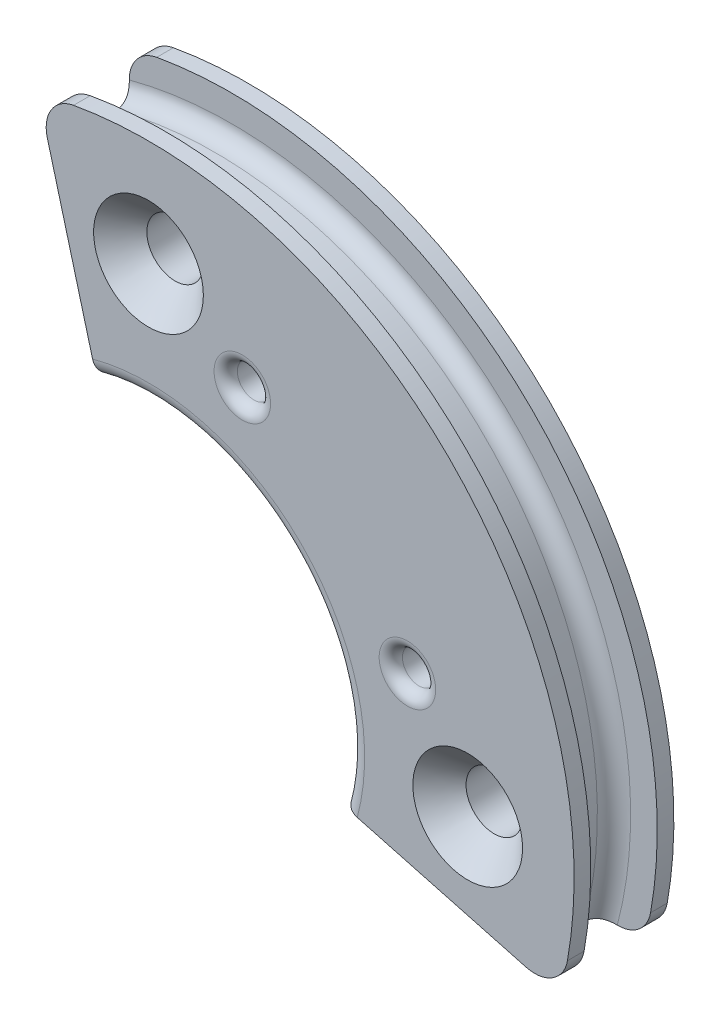
ISO-10303-21;
HEADER;
FILE_DESCRIPTION(('STEP AP214'),'2;1');
FILE_NAME('part.step','',(''),(''),'','','');
FILE_SCHEMA(('AUTOMOTIVE_DESIGN { 1 0 10303 214 1 1 1 1 }'));
ENDSEC;
DATA;
#1=APPLICATION_CONTEXT('core data for automotive mechanical design processes');
#2=APPLICATION_PROTOCOL_DEFINITION('international standard','automotive_design',2000,#1);
#3=PRODUCT_CONTEXT('',#1,'mechanical');
#4=PRODUCT('Part','Part','',(#3));
#5=PRODUCT_RELATED_PRODUCT_CATEGORY('part','',(#4));
#6=PRODUCT_DEFINITION_FORMATION('','',#4);
#7=PRODUCT_DEFINITION_CONTEXT('part definition',#1,'design');
#8=PRODUCT_DEFINITION('design','',#6,#7);
#9=PRODUCT_DEFINITION_SHAPE('','',#8);
#10=(LENGTH_UNIT() NAMED_UNIT(*) SI_UNIT(.MILLI.,.METRE.));
#11=(NAMED_UNIT(*) PLANE_ANGLE_UNIT() SI_UNIT($,.RADIAN.));
#12=(NAMED_UNIT(*) SI_UNIT($,.STERADIAN.) SOLID_ANGLE_UNIT());
#13=UNCERTAINTY_MEASURE_WITH_UNIT(LENGTH_MEASURE(1.E-05),#10,'distance_accuracy_value','');
#14=(GEOMETRIC_REPRESENTATION_CONTEXT(3) GLOBAL_UNCERTAINTY_ASSIGNED_CONTEXT((#13)) GLOBAL_UNIT_ASSIGNED_CONTEXT((#10,
#11,#12)) REPRESENTATION_CONTEXT('',''));
#15=CARTESIAN_POINT('',(0.,0.,0.));
#16=DIRECTION('',(0.,0.,1.));
#17=DIRECTION('',(1.,0.,0.));
#18=AXIS2_PLACEMENT_3D('',#15,#16,#17);
#19=CARTESIAN_POINT('',(0.,0.,1.5));
#20=DIRECTION('',(0.,0.,1.));
#21=DIRECTION('',(1.,0.,0.));
#22=AXIS2_PLACEMENT_3D('',#19,#20,#21);
#23=PLANE('',#22);
#24=CARTESIAN_POINT('',(2.82143232026971,7.78746026853087,1.5));
#25=DIRECTION('',(0.,0.,1.));
#26=DIRECTION('',(1.,0.,0.));
#27=AXIS2_PLACEMENT_3D('',#24,#25,#26);
#28=CIRCLE('',#27,0.85);
#29=CARTESIAN_POINT('',(3.67143232026971,7.78746026853087,1.5));
#30=VERTEX_POINT('',#29);
#31=EDGE_CURVE('E350',#30,#30,#28,.F.);
#32=ORIENTED_EDGE('',*,*,#31,.T.);
#33=EDGE_LOOP('',(#32));
#34=FACE_BOUND('',#33,.T.);
#35=CARTESIAN_POINT('',(7.78746026853084,2.82143232026975,1.5));
#36=DIRECTION('',(0.,0.,1.));
#37=DIRECTION('',(1.,0.,0.));
#38=AXIS2_PLACEMENT_3D('',#35,#36,#37);
#39=CIRCLE('',#38,0.850000000000001);
#40=CARTESIAN_POINT('',(8.63746026853084,2.82143232026975,1.5));
#41=VERTEX_POINT('',#40);
#42=EDGE_CURVE('E347',#41,#41,#39,.F.);
#43=ORIENTED_EDGE('',*,*,#42,.T.);
#44=EDGE_LOOP('',(#43));
#45=FACE_BOUND('',#44,.T.);
#46=CARTESIAN_POINT('',(9.6,0.,1.5));
#47=DIRECTION('',(0.,0.,1.));
#48=DIRECTION('',(1.,0.,0.));
#49=AXIS2_PLACEMENT_3D('',#46,#47,#48);
#50=CIRCLE('',#49,1.65);
#51=CARTESIAN_POINT('',(11.25,0.,1.5));
#52=VERTEX_POINT('',#51);
#53=EDGE_CURVE('E338',#52,#52,#50,.F.);
#54=ORIENTED_EDGE('',*,*,#53,.T.);
#55=EDGE_LOOP('',(#54));
#56=FACE_BOUND('',#55,.T.);
#57=CARTESIAN_POINT('',(1.00554662558682E-13,9.6,1.5));
#58=DIRECTION('',(0.,0.,1.));
#59=DIRECTION('',(1.,0.,0.));
#60=AXIS2_PLACEMENT_3D('',#57,#58,#59);
#61=CIRCLE('',#60,1.65);
#62=CARTESIAN_POINT('',(1.6500000000001,9.6,1.5));
#63=VERTEX_POINT('',#62);
#64=EDGE_CURVE('E335',#63,#63,#61,.F.);
#65=ORIENTED_EDGE('',*,*,#64,.T.);
#66=EDGE_LOOP('',(#65));
#67=FACE_BOUND('',#66,.T.);
#68=DIRECTION('',(-0.965925826289068,0.258819045102521,0.));
#69=VECTOR('',#68,1.);
#70=CARTESIAN_POINT('',(14.9002332262777,-3.9925054600165,1.5));
#71=LINE('',#70,#69);
#72=CARTESIAN_POINT('',(11.3569219381653,-3.0430780618347,1.5));
#73=VERTEX_POINT('',#72);
#74=CARTESIAN_POINT('',(6.27851787087894,-1.68232379316639,1.5));
#75=VERTEX_POINT('',#74);
#76=EDGE_CURVE('E467',#73,#75,#71,.T.);
#77=ORIENTED_EDGE('',*,*,#76,.F.);
#78=CARTESIAN_POINT('',(11.6157409832678,-2.07715223554563,1.5));
#79=DIRECTION('',(0.,0.,1.));
#80=DIRECTION('',(1.,0.,0.));
#81=AXIS2_PLACEMENT_3D('',#78,#79,#80);
#82=CIRCLE('',#81,1.);
#83=CARTESIAN_POINT('',(12.6001258123583,-2.2531820860156,1.5));
#84=VERTEX_POINT('',#83);
#85=EDGE_CURVE('E309',#73,#84,#82,.T.);
#86=ORIENTED_EDGE('',*,*,#85,.T.);
#87=CARTESIAN_POINT('',(0.,0.,1.5));
#88=DIRECTION('',(0.,0.,1.));
#89=DIRECTION('',(1.,0.,0.));
#90=AXIS2_PLACEMENT_3D('',#87,#88,#89);
#91=CIRCLE('',#90,12.8);
#92=CARTESIAN_POINT('',(-2.25318208601565,12.6001258123583,1.5));
#93=VERTEX_POINT('',#92);
#94=EDGE_CURVE('E443',#84,#93,#91,.T.);
#95=ORIENTED_EDGE('',*,*,#94,.T.);
#96=CARTESIAN_POINT('',(-2.07715223554568,11.6157409832678,1.5));
#97=DIRECTION('',(0.,0.,1.));
#98=DIRECTION('',(1.,0.,0.));
#99=AXIS2_PLACEMENT_3D('',#96,#97,#98);
#100=CIRCLE('',#99,1.);
#101=CARTESIAN_POINT('',(-3.04307806183475,11.3569219381653,1.5));
#102=VERTEX_POINT('',#101);
#103=EDGE_CURVE('E306',#93,#102,#100,.T.);
#104=ORIENTED_EDGE('',*,*,#103,.T.);
#105=DIRECTION('',(-0.258819045102525,0.965925826289067,0.));
#106=VECTOR('',#105,1.);
#107=CARTESIAN_POINT('',(-3.74363575167314,13.9714388302752,1.5));
#108=LINE('',#107,#106);
#109=CARTESIAN_POINT('',(-1.68232379316641,6.27851787087894,1.5));
#110=VERTEX_POINT('',#109);
#111=EDGE_CURVE('E465',#110,#102,#108,.T.);
#112=ORIENTED_EDGE('',*,*,#111,.F.);
#113=CARTESIAN_POINT('',(0.,0.,1.5));
#114=DIRECTION('',(0.,0.,1.));
#115=DIRECTION('',(1.,0.,0.));
#116=AXIS2_PLACEMENT_3D('',#113,#114,#115);
#117=CIRCLE('',#116,6.5);
#118=EDGE_CURVE('E192',#110,#75,#117,.F.);
#119=ORIENTED_EDGE('',*,*,#118,.T.);
#120=EDGE_LOOP('',(#77,#86,#95,#104,#112,#119));
#121=FACE_BOUND('',#120,.T.);
#122=ADVANCED_FACE('F33',(#34,#45,#56,#67,#121),#23,.T.);
#123=CARTESIAN_POINT('',(0.,0.,-1.5));
#124=DIRECTION('',(0.,0.,1.));
#125=DIRECTION('',(1.,0.,0.));
#126=AXIS2_PLACEMENT_3D('',#123,#124,#125);
#127=PLANE('',#126);
#128=CARTESIAN_POINT('',(7.78746026853084,2.82143232026975,-1.5));
#129=DIRECTION('',(0.,0.,1.));
#130=DIRECTION('',(1.,0.,0.));
#131=AXIS2_PLACEMENT_3D('',#128,#129,#130);
#132=CIRCLE('',#131,0.850000000000001);
#133=CARTESIAN_POINT('',(8.63746026853084,2.82143232026975,-1.5));
#134=VERTEX_POINT('',#133);
#135=EDGE_CURVE('E358',#134,#134,#132,.T.);
#136=ORIENTED_EDGE('',*,*,#135,.T.);
#137=EDGE_LOOP('',(#136));
#138=FACE_BOUND('',#137,.T.);
#139=CARTESIAN_POINT('',(2.82143232026971,7.78746026853087,-1.5));
#140=DIRECTION('',(0.,0.,1.));
#141=DIRECTION('',(1.,0.,0.));
#142=AXIS2_PLACEMENT_3D('',#139,#140,#141);
#143=CIRCLE('',#142,0.85);
#144=CARTESIAN_POINT('',(3.67143232026971,7.78746026853087,-1.5));
#145=VERTEX_POINT('',#144);
#146=EDGE_CURVE('E355',#145,#145,#143,.T.);
#147=ORIENTED_EDGE('',*,*,#146,.T.);
#148=EDGE_LOOP('',(#147));
#149=FACE_BOUND('',#148,.T.);
#150=CARTESIAN_POINT('',(0.,0.,-1.5));
#151=DIRECTION('',(0.,0.,1.));
#152=DIRECTION('',(1.,0.,0.));
#153=AXIS2_PLACEMENT_3D('',#150,#151,#152);
#154=CIRCLE('',#153,12.8);
#155=CARTESIAN_POINT('',(12.6001258123583,-2.2531820860156,-1.5));
#156=VERTEX_POINT('',#155);
#157=CARTESIAN_POINT('',(-2.25318208601565,12.6001258123583,-1.5));
#158=VERTEX_POINT('',#157);
#159=EDGE_CURVE('E375',#156,#158,#154,.T.);
#160=ORIENTED_EDGE('',*,*,#159,.F.);
#161=CARTESIAN_POINT('',(11.6157409832678,-2.07715223554563,-1.5));
#162=DIRECTION('',(0.,0.,1.));
#163=DIRECTION('',(1.,0.,0.));
#164=AXIS2_PLACEMENT_3D('',#161,#162,#163);
#165=CIRCLE('',#164,1.);
#166=CARTESIAN_POINT('',(11.3569219381653,-3.0430780618347,-1.5));
#167=VERTEX_POINT('',#166);
#168=EDGE_CURVE('E300',#156,#167,#165,.F.);
#169=ORIENTED_EDGE('',*,*,#168,.T.);
#170=DIRECTION('',(-0.965925826289068,0.258819045102521,0.));
#171=VECTOR('',#170,1.);
#172=CARTESIAN_POINT('',(14.9002332262777,-3.9925054600165,-1.5));
#173=LINE('',#172,#171);
#174=CARTESIAN_POINT('',(6.27851787087894,-1.68232379316639,-1.5));
#175=VERTEX_POINT('',#174);
#176=EDGE_CURVE('E463',#167,#175,#173,.T.);
#177=ORIENTED_EDGE('',*,*,#176,.T.);
#178=CARTESIAN_POINT('',(0.,0.,-1.5));
#179=DIRECTION('',(0.,0.,1.));
#180=DIRECTION('',(1.,0.,0.));
#181=AXIS2_PLACEMENT_3D('',#178,#179,#180);
#182=CIRCLE('',#181,6.5);
#183=CARTESIAN_POINT('',(-1.68232379316641,6.27851787087894,-1.5));
#184=VERTEX_POINT('',#183);
#185=EDGE_CURVE('E200',#175,#184,#182,.T.);
#186=ORIENTED_EDGE('',*,*,#185,.T.);
#187=DIRECTION('',(-0.258819045102525,0.965925826289067,0.));
#188=VECTOR('',#187,1.);
#189=CARTESIAN_POINT('',(-3.74363575167314,13.9714388302752,-1.5));
#190=LINE('',#189,#188);
#191=CARTESIAN_POINT('',(-3.04307806183475,11.3569219381653,-1.5));
#192=VERTEX_POINT('',#191);
#193=EDGE_CURVE('E154',#184,#192,#190,.T.);
#194=ORIENTED_EDGE('',*,*,#193,.T.);
#195=CARTESIAN_POINT('',(-2.07715223554568,11.6157409832678,-1.5));
#196=DIRECTION('',(0.,0.,1.));
#197=DIRECTION('',(1.,0.,0.));
#198=AXIS2_PLACEMENT_3D('',#195,#196,#197);
#199=CIRCLE('',#198,1.);
#200=EDGE_CURVE('E307',#192,#158,#199,.F.);
#201=ORIENTED_EDGE('',*,*,#200,.T.);
#202=EDGE_LOOP('',(#160,#169,#177,#186,#194,#201));
#203=FACE_BOUND('',#202,.T.);
#204=CARTESIAN_POINT('',(9.6,0.,-1.5));
#205=DIRECTION('',(0.,0.,1.));
#206=DIRECTION('',(1.,0.,0.));
#207=AXIS2_PLACEMENT_3D('',#204,#205,#206);
#208=CIRCLE('',#207,0.85);
#209=CARTESIAN_POINT('',(10.45,0.,-1.5));
#210=VERTEX_POINT('',#209);
#211=EDGE_CURVE('E180',#210,#210,#208,.T.);
#212=ORIENTED_EDGE('',*,*,#211,.T.);
#213=EDGE_LOOP('',(#212));
#214=FACE_BOUND('',#213,.T.);
#215=CARTESIAN_POINT('',(1.00554662558682E-13,9.6,-1.5));
#216=DIRECTION('',(0.,0.,1.));
#217=DIRECTION('',(1.,0.,0.));
#218=AXIS2_PLACEMENT_3D('',#215,#216,#217);
#219=CIRCLE('',#218,0.85);
#220=CARTESIAN_POINT('',(0.8500000000001,9.6,-1.5));
#221=VERTEX_POINT('',#220);
#222=EDGE_CURVE('E172',#221,#221,#219,.T.);
#223=ORIENTED_EDGE('',*,*,#222,.T.);
#224=EDGE_LOOP('',(#223));
#225=FACE_BOUND('',#224,.T.);
#226=ADVANCED_FACE('F267',(#138,#149,#203,#214,#225),#127,.F.);
#227=CARTESIAN_POINT('',(0.,0.,1.5));
#228=DIRECTION('',(0.,0.,-1.));
#229=DIRECTION('',(-1.,0.,0.));
#230=AXIS2_PLACEMENT_3D('',#227,#228,#229);
#231=CYLINDRICAL_SURFACE('',#230,6.);
#232=DIRECTION('',(0.,0.,-1.));
#233=VECTOR('',#232,1.);
#234=CARTESIAN_POINT('',(5.79555495773441,-1.55291427061513,1.5));
#235=LINE('',#234,#233);
#236=CARTESIAN_POINT('',(5.79555495773441,-1.55291427061513,1.));
#237=VERTEX_POINT('',#236);
#238=CARTESIAN_POINT('',(5.79555495773441,-1.55291427061513,-1.));
#239=VERTEX_POINT('',#238);
#240=EDGE_CURVE('E449',#237,#239,#235,.T.);
#241=ORIENTED_EDGE('',*,*,#240,.F.);
#242=CARTESIAN_POINT('',(0.,0.,1.));
#243=DIRECTION('',(0.,0.,1.));
#244=DIRECTION('',(1.,0.,0.));
#245=AXIS2_PLACEMENT_3D('',#242,#243,#244);
#246=CIRCLE('',#245,6.);
#247=CARTESIAN_POINT('',(-1.55291427061515,5.7955549577344,1.));
#248=VERTEX_POINT('',#247);
#249=EDGE_CURVE('E185',#237,#248,#246,.T.);
#250=ORIENTED_EDGE('',*,*,#249,.T.);
#251=DIRECTION('',(0.,0.,-1.));
#252=VECTOR('',#251,1.);
#253=CARTESIAN_POINT('',(-1.55291427061515,5.7955549577344,1.5));
#254=LINE('',#253,#252);
#255=CARTESIAN_POINT('',(-1.55291427061515,5.7955549577344,-1.));
#256=VERTEX_POINT('',#255);
#257=EDGE_CURVE('E457',#256,#248,#254,.F.);
#258=ORIENTED_EDGE('',*,*,#257,.F.);
#259=CARTESIAN_POINT('',(0.,0.,-1.));
#260=DIRECTION('',(0.,0.,1.));
#261=DIRECTION('',(1.,0.,0.));
#262=AXIS2_PLACEMENT_3D('',#259,#260,#261);
#263=CIRCLE('',#262,6.);
#264=EDGE_CURVE('E183',#256,#239,#263,.F.);
#265=ORIENTED_EDGE('',*,*,#264,.T.);
#266=EDGE_LOOP('',(#241,#250,#258,#265));
#267=FACE_BOUND('',#266,.T.);
#268=ADVANCED_FACE('F273',(#267),#231,.F.);
#269=CARTESIAN_POINT('',(9.6,0.,1.5));
#270=DIRECTION('',(0.,0.,-1.));
#271=DIRECTION('',(-1.,0.,0.));
#272=AXIS2_PLACEMENT_3D('',#269,#270,#271);
#273=CYLINDRICAL_SURFACE('',#272,0.85);
#274=CARTESIAN_POINT('',(9.6,0.,0.700000000000005));
#275=DIRECTION('',(0.,0.,1.));
#276=DIRECTION('',(1.,0.,0.));
#277=AXIS2_PLACEMENT_3D('',#274,#275,#276);
#278=CIRCLE('',#277,0.85);
#279=CARTESIAN_POINT('',(10.45,0.,0.700000000000005));
#280=VERTEX_POINT('',#279);
#281=EDGE_CURVE('E330',#280,#280,#278,.T.);
#282=ORIENTED_EDGE('',*,*,#281,.T.);
#283=EDGE_LOOP('',(#282));
#284=FACE_BOUND('',#283,.T.);
#285=ORIENTED_EDGE('',*,*,#211,.F.);
#286=EDGE_LOOP('',(#285));
#287=FACE_BOUND('',#286,.T.);
#288=ADVANCED_FACE('F381',(#284,#287),#273,.F.);
#289=CARTESIAN_POINT('',(1.00554662558682E-13,9.6,1.5));
#290=DIRECTION('',(0.,0.,-1.));
#291=DIRECTION('',(-1.,0.,0.));
#292=AXIS2_PLACEMENT_3D('',#289,#290,#291);
#293=CYLINDRICAL_SURFACE('',#292,0.85);
#294=CARTESIAN_POINT('',(1.00554662558682E-13,9.6,0.700000000000002));
#295=DIRECTION('',(0.,0.,1.));
#296=DIRECTION('',(1.,0.,0.));
#297=AXIS2_PLACEMENT_3D('',#294,#295,#296);
#298=CIRCLE('',#297,0.85);
#299=CARTESIAN_POINT('',(0.8500000000001,9.6,0.700000000000002));
#300=VERTEX_POINT('',#299);
#301=EDGE_CURVE('E341',#300,#300,#298,.T.);
#302=ORIENTED_EDGE('',*,*,#301,.T.);
#303=EDGE_LOOP('',(#302));
#304=FACE_BOUND('',#303,.T.);
#305=ORIENTED_EDGE('',*,*,#222,.F.);
#306=EDGE_LOOP('',(#305));
#307=FACE_BOUND('',#306,.T.);
#308=ADVANCED_FACE('F264',(#304,#307),#293,.F.);
#309=CARTESIAN_POINT('',(0.,0.,-0.499999999999998));
#310=DIRECTION('',(0.,0.,1.));
#311=DIRECTION('',(1.,0.,0.));
#312=AXIS2_PLACEMENT_3D('',#309,#310,#311);
#313=TOROIDAL_SURFACE('',#312,12.,0.500000000000002);
#314=CARTESIAN_POINT('',(11.5911099154688,-3.10582854123025,-0.499999999999998));
#315=DIRECTION('',(0.258819045102521,0.965925826289068,0.));
#316=DIRECTION('',(-0.965925826289068,0.258819045102521,0.));
#317=AXIS2_PLACEMENT_3D('',#314,#315,#316);
#318=CIRCLE('',#317,0.500000000000002);
#319=CARTESIAN_POINT('',(11.3569219381653,-3.0430780618347,-0.937285225707565));
#320=VERTEX_POINT('',#319);
#321=CARTESIAN_POINT('',(11.1081470023243,-2.97641901867899,-0.499999999999998));
#322=VERTEX_POINT('',#321);
#323=EDGE_CURVE('E452',#320,#322,#318,.T.);
#324=ORIENTED_EDGE('',*,*,#323,.F.);
#325=CARTESIAN_POINT('',(11.3569219381653,-3.0430780618347,-0.937285225707565));
#326=CARTESIAN_POINT('',(11.3788907022271,-3.04899831611114,-0.949943539683777));
#327=CARTESIAN_POINT('',(11.4020780861868,-3.05437532809976,-0.960766771828405));
#328=CARTESIAN_POINT('',(11.4496007428172,-3.06353569894288,-0.978371417856458));
#329=CARTESIAN_POINT('',(11.4738969178736,-3.06735312809629,-0.985240754489292));
#330=CARTESIAN_POINT('',(11.5149442494263,-3.07219577508378,-0.993465018538642));
#331=CARTESIAN_POINT('',(11.531426924697,-3.07372956647898,-0.995903041619362));
#332=CARTESIAN_POINT('',(11.5648655383223,-3.07600064981872,-0.999184648848311));
#333=CARTESIAN_POINT('',(11.581824849703,-3.07672517119939,-1.00000282200904));
#334=CARTESIAN_POINT('',(11.59879381403,-3.07700862196078,-1.00000000000002));
#335=B_SPLINE_CURVE_WITH_KNOTS('',3,(#325,#326,#327,#328,#329,#330,#331,#332,#333,#334),
.UNSPECIFIED.,.F.,.F.,(4,2,2,2,4),(0.,0.0780439203151207,0.154277705368697,0.204380010066996,
0.25526224375088),.UNSPECIFIED.);
#336=CARTESIAN_POINT('',(11.59879381403,-3.0770086219606,-1.));
#337=VERTEX_POINT('',#336);
#338=EDGE_CURVE('E216',#320,#337,#335,.T.);
#339=ORIENTED_EDGE('',*,*,#338,.T.);
#340=CARTESIAN_POINT('',(0.,0.,-1.));
#341=DIRECTION('',(0.,0.,1.));
#342=DIRECTION('',(1.,0.,0.));
#343=AXIS2_PLACEMENT_3D('',#340,#341,#342);
#344=CIRCLE('',#343,12.);
#345=CARTESIAN_POINT('',(-3.07700862196066,11.59879381403,-1.));
#346=VERTEX_POINT('',#345);
#347=EDGE_CURVE('E174',#337,#346,#344,.T.);
#348=ORIENTED_EDGE('',*,*,#347,.T.);
#349=CARTESIAN_POINT('',(-3.07700862196066,11.59879381403,-1.));
#350=CARTESIAN_POINT('',(-3.07660458449419,11.5727601819554,-1.00003894836341));
#351=CARTESIAN_POINT('',(-3.07511026037198,11.5467286746794,-0.998086003587239));
#352=CARTESIAN_POINT('',(-3.07027226218953,11.4960485993055,-0.990321356288697));
#353=CARTESIAN_POINT('',(-3.06697226123266,11.4713819615224,-0.984600153749769));
#354=CARTESIAN_POINT('',(-3.06020836080265,11.4317329932909,-0.972022151730217));
#355=CARTESIAN_POINT('',(-3.05718836163848,11.4163292860042,-0.966226791143053));
#356=CARTESIAN_POINT('',(-3.05054927334866,11.386085156282,-0.952986500989708));
#357=CARTESIAN_POINT('',(-3.0469215908292,11.3712572336561,-0.945517299304913));
#358=CARTESIAN_POINT('',(-3.04307806183475,11.3569219381653,-0.937285225707566));
#359=B_SPLINE_CURVE_WITH_KNOTS('',3,(#349,#350,#351,#352,#353,#354,#355,#356,#357,#358),
.UNSPECIFIED.,.F.,.F.,(4,2,2,2,4),(0.,0.0780427071951764,0.154276292796439,0.204379307922696,
0.255262197451977),.UNSPECIFIED.);
#360=CARTESIAN_POINT('',(-3.04307806183475,11.3569219381653,-0.937285225707565));
#361=VERTEX_POINT('',#360);
#362=EDGE_CURVE('E209',#346,#361,#359,.T.);
#363=ORIENTED_EDGE('',*,*,#362,.T.);
#364=CARTESIAN_POINT('',(-3.1058285412303,11.5911099154688,-0.499999999999998));
#365=DIRECTION('',(0.965925826289067,0.258819045102525,0.));
#366=DIRECTION('',(-0.258819045102525,0.965925826289067,0.));
#367=AXIS2_PLACEMENT_3D('',#364,#365,#366);
#368=CIRCLE('',#367,0.500000000000002);
#369=CARTESIAN_POINT('',(-2.97641901867904,11.1081470023243,-0.499999999999998));
#370=VERTEX_POINT('',#369);
#371=EDGE_CURVE('E164',#370,#361,#368,.T.);
#372=ORIENTED_EDGE('',*,*,#371,.F.);
#373=CARTESIAN_POINT('',(0.,0.,-0.499999999999998));
#374=DIRECTION('',(0.,0.,1.));
#375=DIRECTION('',(1.,0.,0.));
#376=AXIS2_PLACEMENT_3D('',#373,#374,#375);
#377=CIRCLE('',#376,11.5);
#378=EDGE_CURVE('E163',#322,#370,#377,.T.);
#379=ORIENTED_EDGE('',*,*,#378,.F.);
#380=EDGE_LOOP('',(#324,#339,#348,#363,#372,#379));
#381=FACE_BOUND('',#380,.T.);
#382=ADVANCED_FACE('F222',(#381),#313,.F.);
#383=CARTESIAN_POINT('',(0.,0.,0.));
#384=DIRECTION('',(0.,0.,1.));
#385=DIRECTION('',(1.,0.,0.));
#386=AXIS2_PLACEMENT_3D('',#383,#384,#385);
#387=CYLINDRICAL_SURFACE('',#386,11.5);
#388=DIRECTION('',(0.,0.,1.));
#389=VECTOR('',#388,1.);
#390=CARTESIAN_POINT('',(11.1081470023243,-2.97641901867899,0.));
#391=LINE('',#390,#389);
#392=CARTESIAN_POINT('',(11.1081470023243,-2.97641901867899,0.499999999999998));
#393=VERTEX_POINT('',#392);
#394=EDGE_CURVE('E454',#322,#393,#391,.T.);
#395=ORIENTED_EDGE('',*,*,#394,.F.);
#396=ORIENTED_EDGE('',*,*,#378,.T.);
#397=DIRECTION('',(0.,0.,1.));
#398=VECTOR('',#397,1.);
#399=CARTESIAN_POINT('',(-2.97641901867904,11.1081470023243,0.));
#400=LINE('',#399,#398);
#401=CARTESIAN_POINT('',(-2.97641901867904,11.1081470023243,0.499999999999998));
#402=VERTEX_POINT('',#401);
#403=EDGE_CURVE('E149',#402,#370,#400,.F.);
#404=ORIENTED_EDGE('',*,*,#403,.F.);
#405=CARTESIAN_POINT('',(0.,0.,0.499999999999998));
#406=DIRECTION('',(0.,0.,1.));
#407=DIRECTION('',(1.,0.,0.));
#408=AXIS2_PLACEMENT_3D('',#405,#406,#407);
#409=CIRCLE('',#408,11.5);
#410=EDGE_CURVE('E161',#393,#402,#409,.T.);
#411=ORIENTED_EDGE('',*,*,#410,.F.);
#412=EDGE_LOOP('',(#395,#396,#404,#411));
#413=FACE_BOUND('',#412,.T.);
#414=ADVANCED_FACE('F160',(#413),#387,.T.);
#415=CARTESIAN_POINT('',(0.,0.,0.499999999999998));
#416=DIRECTION('',(0.,0.,1.));
#417=DIRECTION('',(1.,0.,0.));
#418=AXIS2_PLACEMENT_3D('',#415,#416,#417);
#419=TOROIDAL_SURFACE('',#418,12.,0.500000000000002);
#420=CARTESIAN_POINT('',(0.,0.,1.));
#421=DIRECTION('',(0.,0.,1.));
#422=DIRECTION('',(1.,0.,0.));
#423=AXIS2_PLACEMENT_3D('',#420,#421,#422);
#424=CIRCLE('',#423,12.);
#425=CARTESIAN_POINT('',(11.59879381403,-3.07700862196061,1.));
#426=VERTEX_POINT('',#425);
#427=CARTESIAN_POINT('',(-3.07700862196067,11.59879381403,1.));
#428=VERTEX_POINT('',#427);
#429=EDGE_CURVE('E170',#426,#428,#424,.T.);
#430=ORIENTED_EDGE('',*,*,#429,.F.);
#431=CARTESIAN_POINT('',(11.59879381403,-3.07700862196061,1.));
#432=CARTESIAN_POINT('',(11.5727601819554,-3.07660458449414,1.00003894836341));
#433=CARTESIAN_POINT('',(11.5467286746794,-3.07511026037193,0.998086003587239));
#434=CARTESIAN_POINT('',(11.4960485993056,-3.07027226218948,0.990321356288697));
#435=CARTESIAN_POINT('',(11.4713819615224,-3.06697226123261,0.984600153749768));
#436=CARTESIAN_POINT('',(11.4317329932909,-3.0602083608026,0.972022151730217));
#437=CARTESIAN_POINT('',(11.4163292860042,-3.05718836163843,0.966226791143054));
#438=CARTESIAN_POINT('',(11.386085156282,-3.05054927334861,0.952986500989709));
#439=CARTESIAN_POINT('',(11.3712572336561,-3.04692159082915,0.945517299304914));
#440=CARTESIAN_POINT('',(11.3569219381653,-3.0430780618347,0.937285225707565));
#441=B_SPLINE_CURVE_WITH_KNOTS('',3,(#431,#432,#433,#434,#435,#436,#437,#438,#439,#440),
.UNSPECIFIED.,.F.,.F.,(4,2,2,2,4),(0.,0.0780427071951764,0.154276292796439,0.204379307922698,
0.255262197451979),.UNSPECIFIED.);
#442=CARTESIAN_POINT('',(11.3569219381653,-3.0430780618347,0.937285225707565));
#443=VERTEX_POINT('',#442);
#444=EDGE_CURVE('E247',#426,#443,#441,.T.);
#445=ORIENTED_EDGE('',*,*,#444,.T.);
#446=CARTESIAN_POINT('',(11.5911099154688,-3.10582854123025,0.499999999999998));
#447=DIRECTION('',(0.258819045102521,0.965925826289068,0.));
#448=DIRECTION('',(-0.965925826289068,0.258819045102521,0.));
#449=AXIS2_PLACEMENT_3D('',#446,#447,#448);
#450=CIRCLE('',#449,0.500000000000002);
#451=EDGE_CURVE('E169',#393,#443,#450,.T.);
#452=ORIENTED_EDGE('',*,*,#451,.F.);
#453=ORIENTED_EDGE('',*,*,#410,.T.);
#454=CARTESIAN_POINT('',(-3.1058285412303,11.5911099154688,0.499999999999998));
#455=DIRECTION('',(0.965925826289067,0.258819045102525,0.));
#456=DIRECTION('',(-0.258819045102525,0.965925826289067,0.));
#457=AXIS2_PLACEMENT_3D('',#454,#455,#456);
#458=CIRCLE('',#457,0.500000000000002);
#459=CARTESIAN_POINT('',(-3.04307806183475,11.3569219381653,0.937285225707565));
#460=VERTEX_POINT('',#459);
#461=EDGE_CURVE('E145',#460,#402,#458,.T.);
#462=ORIENTED_EDGE('',*,*,#461,.F.);
#463=CARTESIAN_POINT('',(-3.04307806183475,11.3569219381653,0.937285225707565));
#464=CARTESIAN_POINT('',(-3.04899831611119,11.3788907022271,0.949943539683777));
#465=CARTESIAN_POINT('',(-3.05437532809981,11.4020780861868,0.960766771828404));
#466=CARTESIAN_POINT('',(-3.06353569894293,11.4496007428172,0.978371417856458));
#467=CARTESIAN_POINT('',(-3.06735312809634,11.4738969178736,0.985240754489291));
#468=CARTESIAN_POINT('',(-3.07219577508383,11.5149442494263,0.993465018538642));
#469=CARTESIAN_POINT('',(-3.07372956647903,11.5314269246969,0.995903041619362));
#470=CARTESIAN_POINT('',(-3.07600064981877,11.5648655383223,0.999184648848312));
#471=CARTESIAN_POINT('',(-3.07672517119944,11.5818248497029,1.00000282200904));
#472=CARTESIAN_POINT('',(-3.07700862196083,11.5987938140299,1.00000000000002));
#473=B_SPLINE_CURVE_WITH_KNOTS('',3,(#463,#464,#465,#466,#467,#468,#469,#470,#471,#472),
.UNSPECIFIED.,.F.,.F.,(4,2,2,2,4),(0.,0.0780439203151175,0.154277705368694,0.204380010066994,
0.255262243750883),.UNSPECIFIED.);
#474=EDGE_CURVE('E48',#460,#428,#473,.T.);
#475=ORIENTED_EDGE('',*,*,#474,.T.);
#476=EDGE_LOOP('',(#430,#445,#452,#453,#462,#475));
#477=FACE_BOUND('',#476,.T.);
#478=ADVANCED_FACE('F167',(#477),#419,.F.);
#479=CARTESIAN_POINT('',(12.,0.,-1.));
#480=DIRECTION('',(0.,0.,1.));
#481=DIRECTION('',(1.,0.,0.));
#482=AXIS2_PLACEMENT_3D('',#479,#480,#481);
#483=PLANE('',#482);
#484=ORIENTED_EDGE('',*,*,#347,.F.);
#485=CARTESIAN_POINT('',(11.6157409832678,-2.07715223554563,-1.));
#486=DIRECTION('',(0.,0.,1.));
#487=DIRECTION('',(1.,0.,0.));
#488=AXIS2_PLACEMENT_3D('',#485,#486,#487);
#489=CIRCLE('',#488,1.);
#490=CARTESIAN_POINT('',(12.6001258123583,-2.2531820860156,-1.));
#491=VERTEX_POINT('',#490);
#492=EDGE_CURVE('E486',#337,#491,#489,.T.);
#493=ORIENTED_EDGE('',*,*,#492,.T.);
#494=CARTESIAN_POINT('',(0.,0.,-1.));
#495=DIRECTION('',(0.,0.,1.));
#496=DIRECTION('',(1.,0.,0.));
#497=AXIS2_PLACEMENT_3D('',#494,#495,#496);
#498=CIRCLE('',#497,12.8);
#499=CARTESIAN_POINT('',(-2.25318208601565,12.6001258123583,-1.));
#500=VERTEX_POINT('',#499);
#501=EDGE_CURVE('E437',#491,#500,#498,.T.);
#502=ORIENTED_EDGE('',*,*,#501,.T.);
#503=CARTESIAN_POINT('',(-2.07715223554568,11.6157409832678,-1.));
#504=DIRECTION('',(0.,0.,1.));
#505=DIRECTION('',(1.,0.,0.));
#506=AXIS2_PLACEMENT_3D('',#503,#504,#505);
#507=CIRCLE('',#506,1.);
#508=EDGE_CURVE('E485',#500,#346,#507,.T.);
#509=ORIENTED_EDGE('',*,*,#508,.T.);
#510=EDGE_LOOP('',(#484,#493,#502,#509));
#511=FACE_BOUND('',#510,.T.);
#512=ADVANCED_FACE('F257',(#511),#483,.T.);
#513=CARTESIAN_POINT('',(0.,0.,0.));
#514=DIRECTION('',(0.,0.,1.));
#515=DIRECTION('',(1.,0.,0.));
#516=AXIS2_PLACEMENT_3D('',#513,#514,#515);
#517=CYLINDRICAL_SURFACE('',#516,12.8);
#518=ORIENTED_EDGE('',*,*,#501,.F.);
#519=DIRECTION('',(0.,0.,1.));
#520=VECTOR('',#519,1.);
#521=CARTESIAN_POINT('',(12.6001258123583,-2.2531820860156,0.));
#522=LINE('',#521,#520);
#523=EDGE_CURVE('E302',#491,#156,#522,.F.);
#524=ORIENTED_EDGE('',*,*,#523,.T.);
#525=ORIENTED_EDGE('',*,*,#159,.T.);
#526=DIRECTION('',(0.,0.,1.));
#527=VECTOR('',#526,1.);
#528=CARTESIAN_POINT('',(-2.25318208601565,12.6001258123583,0.));
#529=LINE('',#528,#527);
#530=EDGE_CURVE('E439',#158,#500,#529,.T.);
#531=ORIENTED_EDGE('',*,*,#530,.T.);
#532=EDGE_LOOP('',(#518,#524,#525,#531));
#533=FACE_BOUND('',#532,.T.);
#534=ADVANCED_FACE('F427',(#533),#517,.T.);
#535=CARTESIAN_POINT('',(0.,0.,0.));
#536=DIRECTION('',(0.,0.,1.));
#537=DIRECTION('',(1.,0.,0.));
#538=AXIS2_PLACEMENT_3D('',#535,#536,#537);
#539=CYLINDRICAL_SURFACE('',#538,12.8);
#540=ORIENTED_EDGE('',*,*,#94,.F.);
#541=DIRECTION('',(0.,0.,1.));
#542=VECTOR('',#541,1.);
#543=CARTESIAN_POINT('',(12.6001258123583,-2.2531820860156,0.));
#544=LINE('',#543,#542);
#545=CARTESIAN_POINT('',(12.6001258123583,-2.2531820860156,1.));
#546=VERTEX_POINT('',#545);
#547=EDGE_CURVE('E317',#84,#546,#544,.F.);
#548=ORIENTED_EDGE('',*,*,#547,.T.);
#549=CARTESIAN_POINT('',(0.,0.,1.));
#550=DIRECTION('',(0.,0.,1.));
#551=DIRECTION('',(1.,0.,0.));
#552=AXIS2_PLACEMENT_3D('',#549,#550,#551);
#553=CIRCLE('',#552,12.8);
#554=CARTESIAN_POINT('',(-2.25318208601565,12.6001258123583,1.));
#555=VERTEX_POINT('',#554);
#556=EDGE_CURVE('E324',#546,#555,#553,.T.);
#557=ORIENTED_EDGE('',*,*,#556,.T.);
#558=DIRECTION('',(0.,0.,1.));
#559=VECTOR('',#558,1.);
#560=CARTESIAN_POINT('',(-2.25318208601565,12.6001258123583,0.));
#561=LINE('',#560,#559);
#562=EDGE_CURVE('E315',#555,#93,#561,.T.);
#563=ORIENTED_EDGE('',*,*,#562,.T.);
#564=EDGE_LOOP('',(#540,#548,#557,#563));
#565=FACE_BOUND('',#564,.T.);
#566=ADVANCED_FACE('F425',(#565),#539,.T.);
#567=CARTESIAN_POINT('',(12.,0.,1.));
#568=DIRECTION('',(0.,0.,-1.));
#569=DIRECTION('',(-1.,0.,0.));
#570=AXIS2_PLACEMENT_3D('',#567,#568,#569);
#571=PLANE('',#570);
#572=ORIENTED_EDGE('',*,*,#556,.F.);
#573=CARTESIAN_POINT('',(11.6157409832678,-2.07715223554563,1.));
#574=DIRECTION('',(0.,0.,-1.));
#575=DIRECTION('',(-1.,0.,0.));
#576=AXIS2_PLACEMENT_3D('',#573,#574,#575);
#577=CIRCLE('',#576,1.);
#578=EDGE_CURVE('E248',#546,#426,#577,.T.);
#579=ORIENTED_EDGE('',*,*,#578,.T.);
#580=ORIENTED_EDGE('',*,*,#429,.T.);
#581=CARTESIAN_POINT('',(-2.07715223554568,11.6157409832678,1.));
#582=DIRECTION('',(0.,0.,-1.));
#583=DIRECTION('',(-1.,0.,0.));
#584=AXIS2_PLACEMENT_3D('',#581,#582,#583);
#585=CIRCLE('',#584,1.);
#586=EDGE_CURVE('E318',#428,#555,#585,.T.);
#587=ORIENTED_EDGE('',*,*,#586,.T.);
#588=EDGE_LOOP('',(#572,#579,#580,#587));
#589=FACE_BOUND('',#588,.T.);
#590=ADVANCED_FACE('F323',(#589),#571,.T.);
#591=CARTESIAN_POINT('',(-3.74363575167314,13.9714388302752,-1.5));
#592=DIRECTION('',(0.965925826289067,0.258819045102525,0.));
#593=DIRECTION('',(-0.258819045102525,0.965925826289067,0.));
#594=AXIS2_PLACEMENT_3D('',#591,#592,#593);
#595=PLANE('',#594);
#596=ORIENTED_EDGE('',*,*,#371,.T.);
#597=DIRECTION('',(0.,0.,-1.));
#598=VECTOR('',#597,1.);
#599=CARTESIAN_POINT('',(-3.04307806183475,11.3569219381653,-1.5));
#600=LINE('',#599,#598);
#601=EDGE_CURVE('E328',#361,#192,#600,.T.);
#602=ORIENTED_EDGE('',*,*,#601,.T.);
#603=ORIENTED_EDGE('',*,*,#193,.F.);
#604=CARTESIAN_POINT('',(-1.68232379316641,6.27851787087894,-1.));
#605=DIRECTION('',(0.965925826289067,0.258819045102525,0.));
#606=DIRECTION('',(-0.258819045102525,0.965925826289067,0.));
#607=AXIS2_PLACEMENT_3D('',#604,#605,#606);
#608=CIRCLE('',#607,0.5);
#609=EDGE_CURVE('E188',#184,#256,#608,.F.);
#610=ORIENTED_EDGE('',*,*,#609,.T.);
#611=ORIENTED_EDGE('',*,*,#257,.T.);
#612=CARTESIAN_POINT('',(-1.68232379316641,6.27851787087894,1.));
#613=DIRECTION('',(0.965925826289067,0.258819045102525,0.));
#614=DIRECTION('',(-0.258819045102525,0.965925826289067,0.));
#615=AXIS2_PLACEMENT_3D('',#612,#613,#614);
#616=CIRCLE('',#615,0.5);
#617=EDGE_CURVE('E190',#248,#110,#616,.F.);
#618=ORIENTED_EDGE('',*,*,#617,.T.);
#619=ORIENTED_EDGE('',*,*,#111,.T.);
#620=DIRECTION('',(0.,0.,-1.));
#621=VECTOR('',#620,1.);
#622=CARTESIAN_POINT('',(-3.04307806183475,11.3569219381653,1.));
#623=LINE('',#622,#621);
#624=EDGE_CURVE('E152',#102,#460,#623,.T.);
#625=ORIENTED_EDGE('',*,*,#624,.T.);
#626=ORIENTED_EDGE('',*,*,#461,.T.);
#627=ORIENTED_EDGE('',*,*,#403,.T.);
#628=EDGE_LOOP('',(#596,#602,#603,#610,#611,#618,#619,#625,#626,#627));
#629=FACE_BOUND('',#628,.T.);
#630=ADVANCED_FACE('F148',(#629),#595,.F.);
#631=CARTESIAN_POINT('',(14.9002332262777,-3.9925054600165,-1.5));
#632=DIRECTION('',(0.258819045102521,0.965925826289068,0.));
#633=DIRECTION('',(-0.965925826289068,0.258819045102521,0.));
#634=AXIS2_PLACEMENT_3D('',#631,#632,#633);
#635=PLANE('',#634);
#636=ORIENTED_EDGE('',*,*,#176,.F.);
#637=DIRECTION('',(0.,0.,-1.));
#638=VECTOR('',#637,1.);
#639=CARTESIAN_POINT('',(11.3569219381653,-3.0430780618347,-1.));
#640=LINE('',#639,#638);
#641=EDGE_CURVE('E206',#167,#320,#640,.F.);
#642=ORIENTED_EDGE('',*,*,#641,.T.);
#643=ORIENTED_EDGE('',*,*,#323,.T.);
#644=ORIENTED_EDGE('',*,*,#394,.T.);
#645=ORIENTED_EDGE('',*,*,#451,.T.);
#646=DIRECTION('',(0.,0.,-1.));
#647=VECTOR('',#646,1.);
#648=CARTESIAN_POINT('',(11.3569219381653,-3.0430780618347,1.5));
#649=LINE('',#648,#647);
#650=EDGE_CURVE('E203',#443,#73,#649,.F.);
#651=ORIENTED_EDGE('',*,*,#650,.T.);
#652=ORIENTED_EDGE('',*,*,#76,.T.);
#653=CARTESIAN_POINT('',(6.27851787087894,-1.68232379316639,1.));
#654=DIRECTION('',(0.258819045102521,0.965925826289068,0.));
#655=DIRECTION('',(-0.965925826289068,0.258819045102521,0.));
#656=AXIS2_PLACEMENT_3D('',#653,#654,#655);
#657=CIRCLE('',#656,0.5);
#658=EDGE_CURVE('E198',#75,#237,#657,.F.);
#659=ORIENTED_EDGE('',*,*,#658,.T.);
#660=ORIENTED_EDGE('',*,*,#240,.T.);
#661=CARTESIAN_POINT('',(6.27851787087894,-1.68232379316639,-1.));
#662=DIRECTION('',(0.258819045102521,0.965925826289068,0.));
#663=DIRECTION('',(-0.965925826289068,0.258819045102521,0.));
#664=AXIS2_PLACEMENT_3D('',#661,#662,#663);
#665=CIRCLE('',#664,0.5);
#666=EDGE_CURVE('E195',#239,#175,#665,.F.);
#667=ORIENTED_EDGE('',*,*,#666,.T.);
#668=EDGE_LOOP('',(#636,#642,#643,#644,#645,#651,#652,#659,#660,#667));
#669=FACE_BOUND('',#668,.T.);
#670=ADVANCED_FACE('F410',(#669),#635,.F.);
#671=CARTESIAN_POINT('',(7.78746026853084,2.82143232026975,-1.5));
#672=DIRECTION('',(0.,0.,1.));
#673=DIRECTION('',(1.,0.,0.));
#674=AXIS2_PLACEMENT_3D('',#671,#672,#673);
#675=CYLINDRICAL_SURFACE('',#674,0.500000000000001);
#676=CARTESIAN_POINT('',(7.78746026853084,2.82143232026975,-1.15));
#677=DIRECTION('',(0.,0.,1.));
#678=DIRECTION('',(1.,0.,0.));
#679=AXIS2_PLACEMENT_3D('',#676,#677,#678);
#680=CIRCLE('',#679,0.500000000000001);
#681=CARTESIAN_POINT('',(8.28746026853084,2.82143232026975,-1.15));
#682=VERTEX_POINT('',#681);
#683=EDGE_CURVE('E41',#682,#682,#680,.F.);
#684=ORIENTED_EDGE('',*,*,#683,.T.);
#685=EDGE_LOOP('',(#684));
#686=FACE_BOUND('',#685,.T.);
#687=CARTESIAN_POINT('',(7.78746026853084,2.82143232026975,1.15));
#688=DIRECTION('',(0.,0.,1.));
#689=DIRECTION('',(1.,0.,0.));
#690=AXIS2_PLACEMENT_3D('',#687,#688,#689);
#691=CIRCLE('',#690,0.500000000000001);
#692=CARTESIAN_POINT('',(8.28746026853084,2.82143232026975,1.15));
#693=VERTEX_POINT('',#692);
#694=EDGE_CURVE('E352',#693,#693,#691,.T.);
#695=ORIENTED_EDGE('',*,*,#694,.T.);
#696=EDGE_LOOP('',(#695));
#697=FACE_BOUND('',#696,.T.);
#698=ADVANCED_FACE('F363',(#686,#697),#675,.F.);
#699=CARTESIAN_POINT('',(2.82143232026971,7.78746026853087,-1.5));
#700=DIRECTION('',(0.,0.,1.));
#701=DIRECTION('',(1.,0.,0.));
#702=AXIS2_PLACEMENT_3D('',#699,#700,#701);
#703=CYLINDRICAL_SURFACE('',#702,0.5);
#704=CARTESIAN_POINT('',(2.82143232026971,7.78746026853087,-1.15));
#705=DIRECTION('',(0.,0.,1.));
#706=DIRECTION('',(1.,0.,0.));
#707=AXIS2_PLACEMENT_3D('',#704,#705,#706);
#708=CIRCLE('',#707,0.5);
#709=CARTESIAN_POINT('',(3.32143232026971,7.78746026853087,-1.15));
#710=VERTEX_POINT('',#709);
#711=EDGE_CURVE('E11',#710,#710,#708,.F.);
#712=ORIENTED_EDGE('',*,*,#711,.T.);
#713=EDGE_LOOP('',(#712));
#714=FACE_BOUND('',#713,.T.);
#715=CARTESIAN_POINT('',(2.82143232026971,7.78746026853087,1.15));
#716=DIRECTION('',(0.,0.,1.));
#717=DIRECTION('',(1.,0.,0.));
#718=AXIS2_PLACEMENT_3D('',#715,#716,#717);
#719=CIRCLE('',#718,0.5);
#720=CARTESIAN_POINT('',(3.32143232026971,7.78746026853087,1.15));
#721=VERTEX_POINT('',#720);
#722=EDGE_CURVE('E344',#721,#721,#719,.T.);
#723=ORIENTED_EDGE('',*,*,#722,.T.);
#724=EDGE_LOOP('',(#723));
#725=FACE_BOUND('',#724,.T.);
#726=ADVANCED_FACE('F285',(#714,#725),#703,.F.);
#727=CARTESIAN_POINT('',(0.,0.,1.));
#728=DIRECTION('',(0.,0.,1.));
#729=DIRECTION('',(1.,0.,0.));
#730=AXIS2_PLACEMENT_3D('',#727,#728,#729);
#731=TOROIDAL_SURFACE('',#730,6.5,0.5);
#732=ORIENTED_EDGE('',*,*,#658,.F.);
#733=ORIENTED_EDGE('',*,*,#118,.F.);
#734=ORIENTED_EDGE('',*,*,#617,.F.);
#735=ORIENTED_EDGE('',*,*,#249,.F.);
#736=EDGE_LOOP('',(#732,#733,#734,#735));
#737=FACE_BOUND('',#736,.T.);
#738=ADVANCED_FACE('F281',(#737),#731,.T.);
#739=CARTESIAN_POINT('',(0.,0.,-1.));
#740=DIRECTION('',(0.,0.,1.));
#741=DIRECTION('',(1.,0.,0.));
#742=AXIS2_PLACEMENT_3D('',#739,#740,#741);
#743=TOROIDAL_SURFACE('',#742,6.5,0.5);
#744=ORIENTED_EDGE('',*,*,#666,.F.);
#745=ORIENTED_EDGE('',*,*,#264,.F.);
#746=ORIENTED_EDGE('',*,*,#609,.F.);
#747=ORIENTED_EDGE('',*,*,#185,.F.);
#748=EDGE_LOOP('',(#744,#745,#746,#747));
#749=FACE_BOUND('',#748,.T.);
#750=ADVANCED_FACE('F284',(#749),#743,.T.);
#751=CARTESIAN_POINT('',(11.6157409832678,-2.07715223554563,0.));
#752=DIRECTION('',(0.,0.,1.));
#753=DIRECTION('',(1.,0.,0.));
#754=AXIS2_PLACEMENT_3D('',#751,#752,#753);
#755=CYLINDRICAL_SURFACE('',#754,1.);
#756=ORIENTED_EDGE('',*,*,#168,.F.);
#757=ORIENTED_EDGE('',*,*,#523,.F.);
#758=ORIENTED_EDGE('',*,*,#492,.F.);
#759=ORIENTED_EDGE('',*,*,#338,.F.);
#760=ORIENTED_EDGE('',*,*,#641,.F.);
#761=EDGE_LOOP('',(#756,#757,#758,#759,#760));
#762=FACE_BOUND('',#761,.T.);
#763=ADVANCED_FACE('F288',(#762),#755,.T.);
#764=CARTESIAN_POINT('',(11.6157409832678,-2.07715223554563,0.));
#765=DIRECTION('',(0.,0.,1.));
#766=DIRECTION('',(1.,0.,0.));
#767=AXIS2_PLACEMENT_3D('',#764,#765,#766);
#768=CYLINDRICAL_SURFACE('',#767,1.);
#769=ORIENTED_EDGE('',*,*,#578,.F.);
#770=ORIENTED_EDGE('',*,*,#547,.F.);
#771=ORIENTED_EDGE('',*,*,#85,.F.);
#772=ORIENTED_EDGE('',*,*,#650,.F.);
#773=ORIENTED_EDGE('',*,*,#444,.F.);
#774=EDGE_LOOP('',(#769,#770,#771,#772,#773));
#775=FACE_BOUND('',#774,.T.);
#776=ADVANCED_FACE('F232',(#775),#768,.T.);
#777=CARTESIAN_POINT('',(-2.07715223554568,11.6157409832678,0.));
#778=DIRECTION('',(0.,0.,1.));
#779=DIRECTION('',(1.,0.,0.));
#780=AXIS2_PLACEMENT_3D('',#777,#778,#779);
#781=CYLINDRICAL_SURFACE('',#780,1.);
#782=ORIENTED_EDGE('',*,*,#508,.F.);
#783=ORIENTED_EDGE('',*,*,#530,.F.);
#784=ORIENTED_EDGE('',*,*,#200,.F.);
#785=ORIENTED_EDGE('',*,*,#601,.F.);
#786=ORIENTED_EDGE('',*,*,#362,.F.);
#787=EDGE_LOOP('',(#782,#783,#784,#785,#786));
#788=FACE_BOUND('',#787,.T.);
#789=ADVANCED_FACE('F226',(#788),#781,.T.);
#790=CARTESIAN_POINT('',(-2.07715223554568,11.6157409832678,0.));
#791=DIRECTION('',(0.,0.,1.));
#792=DIRECTION('',(1.,0.,0.));
#793=AXIS2_PLACEMENT_3D('',#790,#791,#792);
#794=CYLINDRICAL_SURFACE('',#793,1.);
#795=ORIENTED_EDGE('',*,*,#103,.F.);
#796=ORIENTED_EDGE('',*,*,#562,.F.);
#797=ORIENTED_EDGE('',*,*,#586,.F.);
#798=ORIENTED_EDGE('',*,*,#474,.F.);
#799=ORIENTED_EDGE('',*,*,#624,.F.);
#800=EDGE_LOOP('',(#795,#796,#797,#798,#799));
#801=FACE_BOUND('',#800,.T.);
#802=ADVANCED_FACE('F231',(#801),#794,.T.);
#803=CARTESIAN_POINT('',(9.6,0.,0.700000000000005));
#804=DIRECTION('',(0.,0.,1.));
#805=DIRECTION('',(1.,0.,0.));
#806=AXIS2_PLACEMENT_3D('',#803,#804,#805);
#807=CONICAL_SURFACE('',#806,0.85,0.785398163397451);
#808=ORIENTED_EDGE('',*,*,#53,.F.);
#809=EDGE_LOOP('',(#808));
#810=FACE_BOUND('',#809,.T.);
#811=ORIENTED_EDGE('',*,*,#281,.F.);
#812=EDGE_LOOP('',(#811));
#813=FACE_BOUND('',#812,.T.);
#814=ADVANCED_FACE('F238',(#810,#813),#807,.F.);
#815=CARTESIAN_POINT('',(1.00554662558682E-13,9.6,0.700000000000002));
#816=DIRECTION('',(0.,0.,1.));
#817=DIRECTION('',(1.,0.,0.));
#818=AXIS2_PLACEMENT_3D('',#815,#816,#817);
#819=CONICAL_SURFACE('',#818,0.85,0.785398163397451);
#820=CARTESIAN_POINT('',(1.6500000000001,9.6,1.5));
#821=CARTESIAN_POINT('',(1.64166666666677,9.6,1.49166666666667));
#822=CARTESIAN_POINT('',(1.63333333333344,9.6,1.48333333333333));
#823=CARTESIAN_POINT('',(1.61666666666677,9.6,1.46666666666667));
#824=CARTESIAN_POINT('',(1.60833333333344,9.6,1.45833333333333));
#825=CARTESIAN_POINT('',(1.59166666666677,9.6,1.44166666666667));
#826=CARTESIAN_POINT('',(1.58333333333344,9.6,1.43333333333333));
#827=CARTESIAN_POINT('',(1.56666666666677,9.6,1.41666666666667));
#828=CARTESIAN_POINT('',(1.55833333333344,9.6,1.40833333333333));
#829=CARTESIAN_POINT('',(1.54166666666677,9.6,1.39166666666667));
#830=CARTESIAN_POINT('',(1.53333333333344,9.6,1.38333333333333));
#831=CARTESIAN_POINT('',(1.51666666666677,9.6,1.36666666666667));
#832=CARTESIAN_POINT('',(1.50833333333344,9.6,1.35833333333333));
#833=CARTESIAN_POINT('',(1.49166666666677,9.6,1.34166666666667));
#834=CARTESIAN_POINT('',(1.48333333333344,9.6,1.33333333333333));
#835=CARTESIAN_POINT('',(1.46666666666677,9.6,1.31666666666667));
#836=CARTESIAN_POINT('',(1.45833333333344,9.6,1.30833333333333));
#837=CARTESIAN_POINT('',(1.44166666666677,9.6,1.29166666666667));
#838=CARTESIAN_POINT('',(1.43333333333344,9.6,1.28333333333333));
#839=CARTESIAN_POINT('',(1.41666666666677,9.6,1.26666666666667));
#840=CARTESIAN_POINT('',(1.40833333333344,9.6,1.25833333333333));
#841=CARTESIAN_POINT('',(1.39166666666677,9.6,1.24166666666667));
#842=CARTESIAN_POINT('',(1.38333333333344,9.6,1.23333333333333));
#843=CARTESIAN_POINT('',(1.36666666666677,9.6,1.21666666666667));
#844=CARTESIAN_POINT('',(1.35833333333344,9.6,1.20833333333333));
#845=CARTESIAN_POINT('',(1.34166666666677,9.6,1.19166666666667));
#846=CARTESIAN_POINT('',(1.33333333333344,9.6,1.18333333333333));
#847=CARTESIAN_POINT('',(1.31666666666677,9.6,1.16666666666667));
#848=CARTESIAN_POINT('',(1.30833333333344,9.6,1.15833333333333));
#849=CARTESIAN_POINT('',(1.29166666666677,9.6,1.14166666666667));
#850=CARTESIAN_POINT('',(1.28333333333344,9.6,1.13333333333333));
#851=CARTESIAN_POINT('',(1.26666666666677,9.6,1.11666666666667));
#852=CARTESIAN_POINT('',(1.25833333333344,9.6,1.10833333333333));
#853=CARTESIAN_POINT('',(1.24166666666677,9.6,1.09166666666667));
#854=CARTESIAN_POINT('',(1.23333333333343,9.6,1.08333333333333));
#855=CARTESIAN_POINT('',(1.21666666666677,9.6,1.06666666666667));
#856=CARTESIAN_POINT('',(1.20833333333343,9.6,1.05833333333333));
#857=CARTESIAN_POINT('',(1.19166666666677,9.6,1.04166666666667));
#858=CARTESIAN_POINT('',(1.18333333333343,9.6,1.03333333333333));
#859=CARTESIAN_POINT('',(1.16666666666677,9.6,1.01666666666667));
#860=CARTESIAN_POINT('',(1.15833333333343,9.6,1.00833333333333));
#861=CARTESIAN_POINT('',(1.14166666666677,9.6,0.991666666666668));
#862=CARTESIAN_POINT('',(1.13333333333343,9.6,0.983333333333334));
#863=CARTESIAN_POINT('',(1.11666666666677,9.6,0.966666666666668));
#864=CARTESIAN_POINT('',(1.10833333333343,9.6,0.958333333333334));
#865=CARTESIAN_POINT('',(1.09166666666677,9.6,0.941666666666668));
#866=CARTESIAN_POINT('',(1.08333333333343,9.6,0.933333333333335));
#867=CARTESIAN_POINT('',(1.06666666666677,9.6,0.916666666666668));
#868=CARTESIAN_POINT('',(1.05833333333343,9.6,0.908333333333335));
#869=CARTESIAN_POINT('',(1.04166666666677,9.6,0.891666666666668));
#870=CARTESIAN_POINT('',(1.03333333333343,9.6,0.883333333333335));
#871=CARTESIAN_POINT('',(1.01666666666677,9.6,0.866666666666668));
#872=CARTESIAN_POINT('',(1.00833333333343,9.6,0.858333333333335));
#873=CARTESIAN_POINT('',(0.991666666666768,9.6,0.841666666666668));
#874=CARTESIAN_POINT('',(0.983333333333434,9.6,0.833333333333335));
#875=CARTESIAN_POINT('',(0.966666666666767,9.6,0.816666666666668));
#876=CARTESIAN_POINT('',(0.958333333333434,9.6,0.808333333333335));
#877=CARTESIAN_POINT('',(0.941666666666767,9.6,0.791666666666668));
#878=CARTESIAN_POINT('',(0.933333333333434,9.6,0.783333333333335));
#879=CARTESIAN_POINT('',(0.916666666666767,9.6,0.766666666666668));
#880=CARTESIAN_POINT('',(0.908333333333434,9.6,0.758333333333335));
#881=CARTESIAN_POINT('',(0.891666666666767,9.6,0.741666666666668));
#882=CARTESIAN_POINT('',(0.883333333333434,9.6,0.733333333333335));
#883=CARTESIAN_POINT('',(0.866666666666767,9.6,0.716666666666668));
#884=CARTESIAN_POINT('',(0.858333333333434,9.6,0.708333333333335));
#885=CARTESIAN_POINT('',(0.8500000000001,9.6,0.700000000000002));
#886=B_SPLINE_CURVE_WITH_KNOTS('',3,(#820,#821,#822,#823,#824,#825,#826,#827,#828,#829,#830,
#831,#832,#833,#834,#835,#836,#837,#838,#839,#840,#841,#842,#843,#844,#845,#846,#847,#848,#849,
#850,#851,#852,#853,#854,#855,#856,#857,#858,#859,#860,#861,#862,#863,#864,#865,#866,#867,#868,
#869,#870,#871,#872,#873,#874,#875,#876,#877,#878,#879,#880,#881,#882,#883,#884,#885),
.UNSPECIFIED.,.F.,.F.,(4,2,2,2,2,2,2,2,2,2,2,2,2,2,2,2,2,2,2,2,2,2,2,2,2,2,2,2,2,2,2,2,4),(0.,
0.0353553390593273,0.0707106781186549,0.106066017177982,0.14142135623731,0.176776695296637,
0.212132034355965,0.247487373415292,0.282842712474619,0.318198051533946,0.353553390593274,
0.388908729652601,0.424264068711929,0.459619407771256,0.494974746830583,0.530330085889911,
0.565685424949238,0.601040764008566,0.636396103067893,0.67175144212722,0.707106781186547,
0.742462120245875,0.777817459305202,0.81317279836453,0.848528137423857,0.883883476483185,
0.919238815542512,0.954594154601839,0.989949493661167,1.02530483272049,1.06066017177982,
1.09601551083915,1.13137084989848),.UNSPECIFIED.);
#887=EDGE_CURVE('BSEAM389',#63,#300,#886,.T.);
#888=ORIENTED_EDGE('',*,*,#64,.F.);
#889=ORIENTED_EDGE('',*,*,#301,.F.);
#890=ORIENTED_EDGE('',*,*,#887,.T.);
#891=ORIENTED_EDGE('',*,*,#887,.F.);
#892=EDGE_LOOP('',(#888,#890,#889,#891));
#893=FACE_BOUND('',#892,.T.);
#894=ADVANCED_FACE('F389',(#893),#819,.F.);
#895=CARTESIAN_POINT('',(2.82143232026971,7.78746026853087,1.15));
#896=DIRECTION('',(0.,0.,1.));
#897=DIRECTION('',(1.,0.,0.));
#898=AXIS2_PLACEMENT_3D('',#895,#896,#897);
#899=TOROIDAL_SURFACE('',#898,0.85,0.35);
#900=ORIENTED_EDGE('',*,*,#31,.F.);
#901=EDGE_LOOP('',(#900));
#902=FACE_BOUND('',#901,.T.);
#903=ORIENTED_EDGE('',*,*,#722,.F.);
#904=EDGE_LOOP('',(#903));
#905=FACE_BOUND('',#904,.T.);
#906=ADVANCED_FACE('F391',(#902,#905),#899,.T.);
#907=CARTESIAN_POINT('',(7.78746026853084,2.82143232026975,1.15));
#908=DIRECTION('',(0.,0.,1.));
#909=DIRECTION('',(1.,0.,0.));
#910=AXIS2_PLACEMENT_3D('',#907,#908,#909);
#911=TOROIDAL_SURFACE('',#910,0.850000000000001,0.35);
#912=ORIENTED_EDGE('',*,*,#42,.F.);
#913=EDGE_LOOP('',(#912));
#914=FACE_BOUND('',#913,.T.);
#915=ORIENTED_EDGE('',*,*,#694,.F.);
#916=EDGE_LOOP('',(#915));
#917=FACE_BOUND('',#916,.T.);
#918=ADVANCED_FACE('F369',(#914,#917),#911,.T.);
#919=CARTESIAN_POINT('',(7.78746026853084,2.82143232026975,-1.15));
#920=DIRECTION('',(0.,0.,1.));
#921=DIRECTION('',(1.,0.,0.));
#922=AXIS2_PLACEMENT_3D('',#919,#920,#921);
#923=TOROIDAL_SURFACE('',#922,0.850000000000001,0.35);
#924=ORIENTED_EDGE('',*,*,#683,.F.);
#925=EDGE_LOOP('',(#924));
#926=FACE_BOUND('',#925,.T.);
#927=ORIENTED_EDGE('',*,*,#135,.F.);
#928=EDGE_LOOP('',(#927));
#929=FACE_BOUND('',#928,.T.);
#930=ADVANCED_FACE('F366',(#926,#929),#923,.T.);
#931=CARTESIAN_POINT('',(2.82143232026971,7.78746026853087,-1.15));
#932=DIRECTION('',(0.,0.,1.));
#933=DIRECTION('',(1.,0.,0.));
#934=AXIS2_PLACEMENT_3D('',#931,#932,#933);
#935=TOROIDAL_SURFACE('',#934,0.85,0.35);
#936=ORIENTED_EDGE('',*,*,#711,.F.);
#937=EDGE_LOOP('',(#936));
#938=FACE_BOUND('',#937,.T.);
#939=ORIENTED_EDGE('',*,*,#146,.F.);
#940=EDGE_LOOP('',(#939));
#941=FACE_BOUND('',#940,.T.);
#942=ADVANCED_FACE('F35',(#938,#941),#935,.T.);
#943=CLOSED_SHELL('',(#122,#226,#268,#288,#308,#382,#414,#478,#512,#534,#566,#590,#630,#670,
#698,#726,#738,#750,#763,#776,#789,#802,#814,#894,#906,#918,#930,#942));
#944=MANIFOLD_SOLID_BREP('B2',#943);
#945=ADVANCED_BREP_SHAPE_REPRESENTATION('',(#18,#944),#14);
#946=SHAPE_DEFINITION_REPRESENTATION(#9,#945);
ENDSEC;
END-ISO-10303-21;
